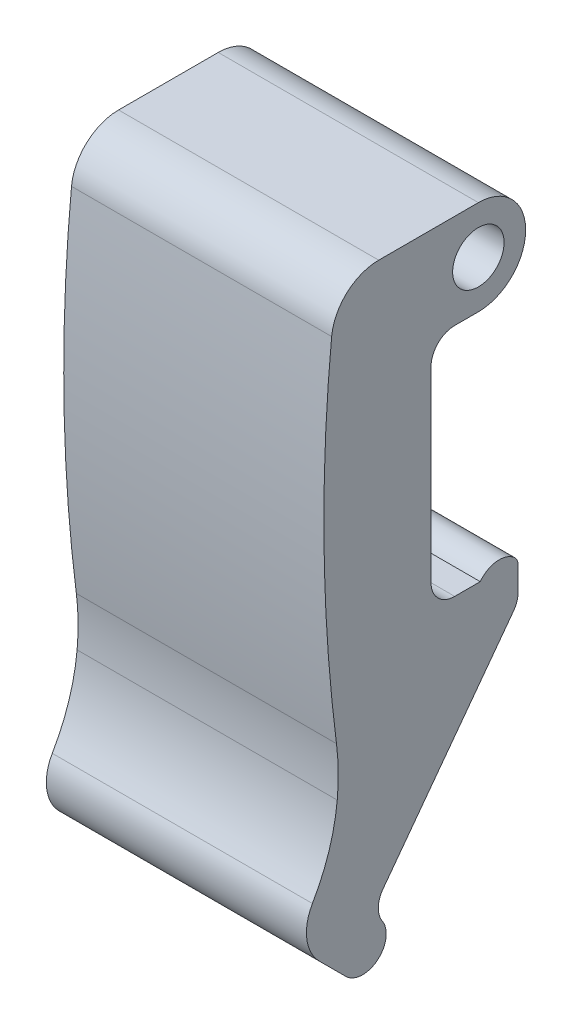
ISO-10303-21;
HEADER;
FILE_DESCRIPTION(('STEP AP214'),'2;1');
FILE_NAME('part.step','',(''),(''),'','','');
FILE_SCHEMA(('AUTOMOTIVE_DESIGN { 1 0 10303 214 1 1 1 1 }'));
ENDSEC;
DATA;
#1=APPLICATION_CONTEXT('core data for automotive mechanical design processes');
#2=APPLICATION_PROTOCOL_DEFINITION('international standard','automotive_design',2000,#1);
#3=PRODUCT_CONTEXT('',#1,'mechanical');
#4=PRODUCT('Part','Part','',(#3));
#5=PRODUCT_RELATED_PRODUCT_CATEGORY('part','',(#4));
#6=PRODUCT_DEFINITION_FORMATION('','',#4);
#7=PRODUCT_DEFINITION_CONTEXT('part definition',#1,'design');
#8=PRODUCT_DEFINITION('design','',#6,#7);
#9=PRODUCT_DEFINITION_SHAPE('','',#8);
#10=(LENGTH_UNIT() NAMED_UNIT(*) SI_UNIT(.MILLI.,.METRE.));
#11=(NAMED_UNIT(*) PLANE_ANGLE_UNIT() SI_UNIT($,.RADIAN.));
#12=(NAMED_UNIT(*) SI_UNIT($,.STERADIAN.) SOLID_ANGLE_UNIT());
#13=UNCERTAINTY_MEASURE_WITH_UNIT(LENGTH_MEASURE(1.E-05),#10,'distance_accuracy_value','');
#14=(GEOMETRIC_REPRESENTATION_CONTEXT(3) GLOBAL_UNCERTAINTY_ASSIGNED_CONTEXT((#13)) GLOBAL_UNIT_ASSIGNED_CONTEXT((#10,
#11,#12)) REPRESENTATION_CONTEXT('',''));
#15=CARTESIAN_POINT('',(0.,0.,0.));
#16=DIRECTION('',(0.,0.,1.));
#17=DIRECTION('',(1.,0.,0.));
#18=AXIS2_PLACEMENT_3D('',#15,#16,#17);
#19=CARTESIAN_POINT('',(8.73125,-19.8755,-1.397));
#20=DIRECTION('',(-1.,0.,0.));
#21=DIRECTION('',(0.,0.,1.));
#22=AXIS2_PLACEMENT_3D('',#19,#20,#21);
#23=CYLINDRICAL_SURFACE('',#22,1.5875);
#24=CARTESIAN_POINT('',(8.73125,-19.8755,-1.397));
#25=DIRECTION('',(1.,0.,0.));
#26=DIRECTION('',(0.,0.,1.));
#27=AXIS2_PLACEMENT_3D('',#24,#25,#26);
#28=CIRCLE('',#27,1.5875);
#29=CARTESIAN_POINT('',(8.73125,-18.6055,-2.3495));
#30=VERTEX_POINT('',#29);
#31=CARTESIAN_POINT('',(8.73125,-18.923,-0.127000000000002));
#32=VERTEX_POINT('',#31);
#33=EDGE_CURVE('E300',#30,#32,#28,.T.);
#34=ORIENTED_EDGE('',*,*,#33,.F.);
#35=DIRECTION('',(-1.,0.,0.));
#36=VECTOR('',#35,1.);
#37=CARTESIAN_POINT('',(8.73125,-18.6055,-2.3495));
#38=LINE('',#37,#36);
#39=CARTESIAN_POINT('',(-8.73125,-18.6055,-2.3495));
#40=VERTEX_POINT('',#39);
#41=EDGE_CURVE('E174',#30,#40,#38,.T.);
#42=ORIENTED_EDGE('',*,*,#41,.T.);
#43=CARTESIAN_POINT('',(-8.73125,-19.8755,-1.397));
#44=DIRECTION('',(1.,0.,0.));
#45=DIRECTION('',(0.,0.,1.));
#46=AXIS2_PLACEMENT_3D('',#43,#44,#45);
#47=CIRCLE('',#46,1.5875);
#48=CARTESIAN_POINT('',(-8.73125,-18.923,-0.127000000000002));
#49=VERTEX_POINT('',#48);
#50=EDGE_CURVE('E168',#40,#49,#47,.T.);
#51=ORIENTED_EDGE('',*,*,#50,.T.);
#52=DIRECTION('',(-1.,0.,0.));
#53=VECTOR('',#52,1.);
#54=CARTESIAN_POINT('',(8.73125,-18.923,-0.127000000000002));
#55=LINE('',#54,#53);
#56=EDGE_CURVE('E172',#32,#49,#55,.T.);
#57=ORIENTED_EDGE('',*,*,#56,.F.);
#58=EDGE_LOOP('',(#34,#42,#51,#57));
#59=FACE_BOUND('',#58,.T.);
#60=ADVANCED_FACE('F32',(#59),#23,.T.);
#61=CARTESIAN_POINT('',(8.73125,-18.923,3.175));
#62=DIRECTION('',(0.,-1.,0.));
#63=DIRECTION('',(0.,0.,-1.));
#64=AXIS2_PLACEMENT_3D('',#61,#62,#63);
#65=PLANE('',#64);
#66=DIRECTION('',(0.,0.,1.));
#67=VECTOR('',#66,1.);
#68=CARTESIAN_POINT('',(-8.73125,-18.923,3.175));
#69=LINE('',#68,#67);
#70=CARTESIAN_POINT('',(-8.73125,-18.923,1.5875));
#71=VERTEX_POINT('',#70);
#72=EDGE_CURVE('E175',#49,#71,#69,.T.);
#73=ORIENTED_EDGE('',*,*,#72,.T.);
#74=DIRECTION('',(-1.,0.,0.));
#75=VECTOR('',#74,1.);
#76=CARTESIAN_POINT('',(8.73125,-18.923,1.5875));
#77=LINE('',#76,#75);
#78=CARTESIAN_POINT('',(8.73125,-18.923,1.5875));
#79=VERTEX_POINT('',#78);
#80=EDGE_CURVE('E225',#71,#79,#77,.F.);
#81=ORIENTED_EDGE('',*,*,#80,.T.);
#82=DIRECTION('',(0.,0.,1.));
#83=VECTOR('',#82,1.);
#84=CARTESIAN_POINT('',(8.73125,-18.923,3.175));
#85=LINE('',#84,#83);
#86=EDGE_CURVE('E189',#32,#79,#85,.T.);
#87=ORIENTED_EDGE('',*,*,#86,.F.);
#88=ORIENTED_EDGE('',*,*,#56,.T.);
#89=EDGE_LOOP('',(#73,#81,#87,#88));
#90=FACE_BOUND('',#89,.T.);
#91=ADVANCED_FACE('F187',(#90),#65,.F.);
#92=CARTESIAN_POINT('',(8.73125,-3.175,3.175));
#93=DIRECTION('',(0.,0.,1.));
#94=DIRECTION('',(0.,-1.,0.));
#95=AXIS2_PLACEMENT_3D('',#92,#93,#94);
#96=PLANE('',#95);
#97=DIRECTION('',(0.,1.,0.));
#98=VECTOR('',#97,1.);
#99=CARTESIAN_POINT('',(8.73125,-3.175,3.175));
#100=LINE('',#99,#98);
#101=CARTESIAN_POINT('',(8.73125,-17.3355,3.175));
#102=VERTEX_POINT('',#101);
#103=CARTESIAN_POINT('',(8.73125,-4.7625,3.175));
#104=VERTEX_POINT('',#103);
#105=EDGE_CURVE('E303',#102,#104,#100,.T.);
#106=ORIENTED_EDGE('',*,*,#105,.F.);
#107=DIRECTION('',(-1.,0.,0.));
#108=VECTOR('',#107,1.);
#109=CARTESIAN_POINT('',(-8.73125,-17.3355,3.175));
#110=LINE('',#109,#108);
#111=CARTESIAN_POINT('',(-8.73125,-17.3355,3.175));
#112=VERTEX_POINT('',#111);
#113=EDGE_CURVE('E222',#102,#112,#110,.T.);
#114=ORIENTED_EDGE('',*,*,#113,.T.);
#115=DIRECTION('',(0.,1.,0.));
#116=VECTOR('',#115,1.);
#117=CARTESIAN_POINT('',(-8.73125,-3.175,3.175));
#118=LINE('',#117,#116);
#119=CARTESIAN_POINT('',(-8.73125,-4.7625,3.175));
#120=VERTEX_POINT('',#119);
#121=EDGE_CURVE('E184',#112,#120,#118,.T.);
#122=ORIENTED_EDGE('',*,*,#121,.T.);
#123=DIRECTION('',(-1.,0.,0.));
#124=VECTOR('',#123,1.);
#125=CARTESIAN_POINT('',(8.73125,-4.7625,3.175));
#126=LINE('',#125,#124);
#127=EDGE_CURVE('E220',#120,#104,#126,.F.);
#128=ORIENTED_EDGE('',*,*,#127,.T.);
#129=EDGE_LOOP('',(#106,#114,#122,#128));
#130=FACE_BOUND('',#129,.T.);
#131=ADVANCED_FACE('F377',(#130),#96,.F.);
#132=CARTESIAN_POINT('',(8.73125,-3.175,0.));
#133=DIRECTION('',(0.,1.,0.));
#134=DIRECTION('',(0.,0.,1.));
#135=AXIS2_PLACEMENT_3D('',#132,#133,#134);
#136=PLANE('',#135);
#137=DIRECTION('',(0.,0.,-1.));
#138=VECTOR('',#137,1.);
#139=CARTESIAN_POINT('',(8.73125,-3.175,0.));
#140=LINE('',#139,#138);
#141=CARTESIAN_POINT('',(8.73125,-3.175,1.5875));
#142=VERTEX_POINT('',#141);
#143=CARTESIAN_POINT('',(8.73125,-3.175,0.));
#144=VERTEX_POINT('',#143);
#145=EDGE_CURVE('E306',#142,#144,#140,.T.);
#146=ORIENTED_EDGE('',*,*,#145,.F.);
#147=DIRECTION('',(-1.,0.,0.));
#148=VECTOR('',#147,1.);
#149=CARTESIAN_POINT('',(-8.73125,-3.175,1.5875));
#150=LINE('',#149,#148);
#151=CARTESIAN_POINT('',(-8.73125,-3.175,1.5875));
#152=VERTEX_POINT('',#151);
#153=EDGE_CURVE('E227',#142,#152,#150,.T.);
#154=ORIENTED_EDGE('',*,*,#153,.T.);
#155=DIRECTION('',(0.,0.,-1.));
#156=VECTOR('',#155,1.);
#157=CARTESIAN_POINT('',(-8.73125,-3.175,0.));
#158=LINE('',#157,#156);
#159=CARTESIAN_POINT('',(-8.73125,-3.175,0.));
#160=VERTEX_POINT('',#159);
#161=EDGE_CURVE('E342',#152,#160,#158,.T.);
#162=ORIENTED_EDGE('',*,*,#161,.T.);
#163=DIRECTION('',(-1.,0.,0.));
#164=VECTOR('',#163,1.);
#165=CARTESIAN_POINT('',(8.73125,-3.175,0.));
#166=LINE('',#165,#164);
#167=EDGE_CURVE('E191',#144,#160,#166,.T.);
#168=ORIENTED_EDGE('',*,*,#167,.F.);
#169=EDGE_LOOP('',(#146,#154,#162,#168));
#170=FACE_BOUND('',#169,.T.);
#171=ADVANCED_FACE('F381',(#170),#136,.F.);
#172=CARTESIAN_POINT('',(8.73125,0.,0.));
#173=DIRECTION('',(-1.,0.,0.));
#174=DIRECTION('',(0.,0.,1.));
#175=AXIS2_PLACEMENT_3D('',#172,#173,#174);
#176=CYLINDRICAL_SURFACE('',#175,3.175);
#177=CARTESIAN_POINT('',(-8.73125,0.,0.));
#178=DIRECTION('',(1.,0.,0.));
#179=DIRECTION('',(0.,0.,-1.));
#180=AXIS2_PLACEMENT_3D('',#177,#178,#179);
#181=CIRCLE('',#180,3.175);
#182=CARTESIAN_POINT('',(-8.73125,3.175,0.));
#183=VERTEX_POINT('',#182);
#184=EDGE_CURVE('E341',#160,#183,#181,.T.);
#185=ORIENTED_EDGE('',*,*,#184,.T.);
#186=DIRECTION('',(-1.,0.,0.));
#187=VECTOR('',#186,1.);
#188=CARTESIAN_POINT('',(8.73125,3.175,0.));
#189=LINE('',#188,#187);
#190=CARTESIAN_POINT('',(8.73125,3.175,0.));
#191=VERTEX_POINT('',#190);
#192=EDGE_CURVE('E197',#191,#183,#189,.T.);
#193=ORIENTED_EDGE('',*,*,#192,.F.);
#194=CARTESIAN_POINT('',(8.73125,0.,0.));
#195=DIRECTION('',(1.,0.,0.));
#196=DIRECTION('',(0.,0.,-1.));
#197=AXIS2_PLACEMENT_3D('',#194,#195,#196);
#198=CIRCLE('',#197,3.175);
#199=EDGE_CURVE('E308',#144,#191,#198,.T.);
#200=ORIENTED_EDGE('',*,*,#199,.F.);
#201=ORIENTED_EDGE('',*,*,#167,.T.);
#202=EDGE_LOOP('',(#185,#193,#200,#201));
#203=FACE_BOUND('',#202,.T.);
#204=ADVANCED_FACE('F387',(#203),#176,.T.);
#205=CARTESIAN_POINT('',(8.73125,3.175,0.));
#206=DIRECTION('',(0.,-1.,0.));
#207=DIRECTION('',(0.,0.,-1.));
#208=AXIS2_PLACEMENT_3D('',#205,#206,#207);
#209=PLANE('',#208);
#210=DIRECTION('',(0.,0.,1.));
#211=VECTOR('',#210,1.);
#212=CARTESIAN_POINT('',(-8.73125,3.175,0.));
#213=LINE('',#212,#211);
#214=CARTESIAN_POINT('',(-8.73125,3.175,6.69032357202773));
#215=VERTEX_POINT('',#214);
#216=EDGE_CURVE('E287',#183,#215,#213,.T.);
#217=ORIENTED_EDGE('',*,*,#216,.T.);
#218=DIRECTION('',(-1.,0.,0.));
#219=VECTOR('',#218,1.);
#220=CARTESIAN_POINT('',(8.73125,3.175,6.69032357202773));
#221=LINE('',#220,#219);
#222=CARTESIAN_POINT('',(8.73125,3.175,6.69032357202773));
#223=VERTEX_POINT('',#222);
#224=EDGE_CURVE('E202',#215,#223,#221,.F.);
#225=ORIENTED_EDGE('',*,*,#224,.T.);
#226=DIRECTION('',(0.,0.,1.));
#227=VECTOR('',#226,1.);
#228=CARTESIAN_POINT('',(8.73125,3.175,0.));
#229=LINE('',#228,#227);
#230=EDGE_CURVE('E310',#191,#223,#229,.T.);
#231=ORIENTED_EDGE('',*,*,#230,.F.);
#232=ORIENTED_EDGE('',*,*,#192,.T.);
#233=EDGE_LOOP('',(#217,#225,#231,#232));
#234=FACE_BOUND('',#233,.T.);
#235=ADVANCED_FACE('F335',(#234),#209,.F.);
#236=CARTESIAN_POINT('',(8.73125,-10.1699174716173,-95.2740901224179));
#237=DIRECTION('',(-1.,0.,0.));
#238=DIRECTION('',(0.,0.,1.));
#239=AXIS2_PLACEMENT_3D('',#236,#237,#238);
#240=CYLINDRICAL_SURFACE('',#239,105.645331713289);
#241=CARTESIAN_POINT('',(8.73125,-10.1699174716173,-95.2740901224179));
#242=DIRECTION('',(1.,0.,0.));
#243=DIRECTION('',(0.,0.,-1.));
#244=AXIS2_PLACEMENT_3D('',#241,#242,#243);
#245=CIRCLE('',#244,105.645331713289);
#246=CARTESIAN_POINT('',(8.73125,0.315110602576465,9.84964791564044));
#247=VERTEX_POINT('',#246);
#248=CARTESIAN_POINT('',(8.73125,-23.5148349432345,9.52500000000001));
#249=VERTEX_POINT('',#248);
#250=EDGE_CURVE('E313',#247,#249,#245,.T.);
#251=ORIENTED_EDGE('',*,*,#250,.F.);
#252=DIRECTION('',(-1.,0.,0.));
#253=VECTOR('',#252,1.);
#254=CARTESIAN_POINT('',(8.73125,0.315110602576465,9.84964791564044));
#255=LINE('',#254,#253);
#256=CARTESIAN_POINT('',(-8.73125,0.315110602576465,9.84964791564044));
#257=VERTEX_POINT('',#256);
#258=EDGE_CURVE('E190',#247,#257,#255,.T.);
#259=ORIENTED_EDGE('',*,*,#258,.T.);
#260=CARTESIAN_POINT('',(-8.73125,-10.1699174716173,-95.2740901224179));
#261=DIRECTION('',(1.,0.,0.));
#262=DIRECTION('',(0.,0.,-1.));
#263=AXIS2_PLACEMENT_3D('',#260,#261,#262);
#264=CIRCLE('',#263,105.645331713289);
#265=CARTESIAN_POINT('',(-8.73125,-23.5148349432345,9.52500000000001));
#266=VERTEX_POINT('',#265);
#267=EDGE_CURVE('E283',#257,#266,#264,.T.);
#268=ORIENTED_EDGE('',*,*,#267,.T.);
#269=DIRECTION('',(-1.,0.,0.));
#270=VECTOR('',#269,1.);
#271=CARTESIAN_POINT('',(8.73125,-23.5148349432345,9.52500000000001));
#272=LINE('',#271,#270);
#273=EDGE_CURVE('E282',#249,#266,#272,.T.);
#274=ORIENTED_EDGE('',*,*,#273,.F.);
#275=EDGE_LOOP('',(#251,#259,#268,#274));
#276=FACE_BOUND('',#275,.T.);
#277=ADVANCED_FACE('F393',(#276),#240,.T.);
#278=CARTESIAN_POINT('',(8.73125,-25.4,24.3294064790796));
#279=DIRECTION('',(-1.,0.,0.));
#280=DIRECTION('',(0.,0.,1.));
#281=AXIS2_PLACEMENT_3D('',#278,#279,#280);
#282=CYLINDRICAL_SURFACE('',#281,14.9239504987474);
#283=CARTESIAN_POINT('',(-8.73125,-25.4,24.3294064790796));
#284=DIRECTION('',(-1.,0.,0.));
#285=DIRECTION('',(0.,0.,1.));
#286=AXIS2_PLACEMENT_3D('',#283,#284,#285);
#287=CIRCLE('',#286,14.9239504987474);
#288=CARTESIAN_POINT('',(-8.73125,-26.8210055343094,9.47326156323667));
#289=VERTEX_POINT('',#288);
#290=EDGE_CURVE('E275',#266,#289,#287,.T.);
#291=ORIENTED_EDGE('',*,*,#290,.T.);
#292=DIRECTION('',(-1.,0.,0.));
#293=VECTOR('',#292,1.);
#294=CARTESIAN_POINT('',(8.73125,-26.8210055343094,9.47326156323667));
#295=LINE('',#294,#293);
#296=CARTESIAN_POINT('',(8.73125,-26.8210055343094,9.47326156323667));
#297=VERTEX_POINT('',#296);
#298=EDGE_CURVE('E244',#289,#297,#295,.F.);
#299=ORIENTED_EDGE('',*,*,#298,.T.);
#300=CARTESIAN_POINT('',(8.73125,-25.4,24.3294064790796));
#301=DIRECTION('',(-1.,0.,0.));
#302=DIRECTION('',(0.,0.,1.));
#303=AXIS2_PLACEMENT_3D('',#300,#301,#302);
#304=CIRCLE('',#303,14.9239504987474);
#305=EDGE_CURVE('E259',#249,#297,#304,.T.);
#306=ORIENTED_EDGE('',*,*,#305,.F.);
#307=ORIENTED_EDGE('',*,*,#273,.T.);
#308=EDGE_LOOP('',(#291,#299,#306,#307));
#309=FACE_BOUND('',#308,.T.);
#310=ADVANCED_FACE('F280',(#309),#282,.F.);
#311=CARTESIAN_POINT('',(8.73125,-33.4915368486735,8.58155713095243));
#312=DIRECTION('',(-1.,0.,0.));
#313=DIRECTION('',(0.,0.,1.));
#314=AXIS2_PLACEMENT_3D('',#311,#312,#313);
#315=CYLINDRICAL_SURFACE('',#314,2.96078469777265);
#316=CARTESIAN_POINT('',(8.73125,-33.4915368486735,8.58155713095243));
#317=DIRECTION('',(1.,0.,0.));
#318=DIRECTION('',(0.,0.,1.));
#319=AXIS2_PLACEMENT_3D('',#316,#317,#318);
#320=CIRCLE('',#319,2.96078469777265);
#321=CARTESIAN_POINT('',(8.73125,-32.0018073719112,11.1402583860094));
#322=VERTEX_POINT('',#321);
#323=CARTESIAN_POINT('',(8.73125,-35.5851277861019,10.6751480683808));
#324=VERTEX_POINT('',#323);
#325=EDGE_CURVE('E256',#322,#324,#320,.T.);
#326=ORIENTED_EDGE('',*,*,#325,.F.);
#327=DIRECTION('',(-1.,0.,0.));
#328=VECTOR('',#327,1.);
#329=CARTESIAN_POINT('',(8.73125,-32.0018073719112,11.1402583860094));
#330=LINE('',#329,#328);
#331=CARTESIAN_POINT('',(-8.73125,-32.0018073719112,11.1402583860094));
#332=VERTEX_POINT('',#331);
#333=EDGE_CURVE('E241',#322,#332,#330,.T.);
#334=ORIENTED_EDGE('',*,*,#333,.T.);
#335=CARTESIAN_POINT('',(-8.73125,-33.4915368486735,8.58155713095243));
#336=DIRECTION('',(1.,0.,0.));
#337=DIRECTION('',(0.,0.,1.));
#338=AXIS2_PLACEMENT_3D('',#335,#336,#337);
#339=CIRCLE('',#338,2.96078469777265);
#340=CARTESIAN_POINT('',(-8.73125,-35.5851277861019,10.6751480683808));
#341=VERTEX_POINT('',#340);
#342=EDGE_CURVE('E277',#332,#341,#339,.T.);
#343=ORIENTED_EDGE('',*,*,#342,.T.);
#344=DIRECTION('',(-1.,0.,0.));
#345=VECTOR('',#344,1.);
#346=CARTESIAN_POINT('',(8.73125,-35.5851277861019,10.6751480683808));
#347=LINE('',#346,#345);
#348=EDGE_CURVE('E267',#324,#341,#347,.T.);
#349=ORIENTED_EDGE('',*,*,#348,.F.);
#350=EDGE_LOOP('',(#326,#334,#343,#349));
#351=FACE_BOUND('',#350,.T.);
#352=ADVANCED_FACE('F264',(#351),#315,.T.);
#353=CARTESIAN_POINT('',(8.73125,-36.8270118242155,9.43326403026727));
#354=DIRECTION('',(0.,0.707106781186568,-0.707106781186527));
#355=DIRECTION('',(0.,0.707106781186527,0.707106781186568));
#356=AXIS2_PLACEMENT_3D('',#353,#354,#355);
#357=PLANE('',#356);
#358=DIRECTION('',(0.,-0.707106781186527,-0.707106781186568));
#359=VECTOR('',#358,1.);
#360=CARTESIAN_POINT('',(-8.73125,-36.8270118242155,9.43326403026727));
#361=LINE('',#360,#359);
#362=CARTESIAN_POINT('',(-8.73125,-37.3658271914796,8.89444866300314));
#363=VERTEX_POINT('',#362);
#364=EDGE_CURVE('E285',#341,#363,#361,.T.);
#365=ORIENTED_EDGE('',*,*,#364,.T.);
#366=DIRECTION('',(-1.,0.,0.));
#367=VECTOR('',#366,1.);
#368=CARTESIAN_POINT('',(8.73125,-37.3658271914796,8.89444866300314));
#369=LINE('',#368,#367);
#370=CARTESIAN_POINT('',(8.73125,-37.3658271914796,8.89444866300314));
#371=VERTEX_POINT('',#370);
#372=EDGE_CURVE('E325',#371,#363,#369,.T.);
#373=ORIENTED_EDGE('',*,*,#372,.F.);
#374=DIRECTION('',(0.,-0.707106781186556,-0.707106781186539));
#375=VECTOR('',#374,1.);
#376=CARTESIAN_POINT('',(8.73125,-36.8270118242155,9.43326403026727));
#377=LINE('',#376,#375);
#378=EDGE_CURVE('E269',#324,#371,#377,.T.);
#379=ORIENTED_EDGE('',*,*,#378,.F.);
#380=ORIENTED_EDGE('',*,*,#348,.T.);
#381=EDGE_LOOP('',(#365,#373,#379,#380));
#382=FACE_BOUND('',#381,.T.);
#383=ADVANCED_FACE('F401',(#382),#357,.F.);
#384=CARTESIAN_POINT('',(8.73125,-36.2432951763459,7.77191664786949));
#385=DIRECTION('',(-1.,0.,0.));
#386=DIRECTION('',(0.,0.,1.));
#387=AXIS2_PLACEMENT_3D('',#384,#385,#386);
#388=CYLINDRICAL_SURFACE('',#387,1.5875);
#389=CARTESIAN_POINT('',(-8.73125,-36.2432951763459,7.77191664786949));
#390=DIRECTION('',(1.,0.,0.));
#391=DIRECTION('',(0.,0.,1.));
#392=AXIS2_PLACEMENT_3D('',#389,#390,#391);
#393=CIRCLE('',#392,1.5875);
#394=CARTESIAN_POINT('',(-8.73125,-35.3609089618565,6.45223834673738));
#395=VERTEX_POINT('',#394);
#396=EDGE_CURVE('E292',#363,#395,#393,.T.);
#397=ORIENTED_EDGE('',*,*,#396,.T.);
#398=DIRECTION('',(-1.,0.,0.));
#399=VECTOR('',#398,1.);
#400=CARTESIAN_POINT('',(8.73125,-35.3609089618565,6.45223834673738));
#401=LINE('',#400,#399);
#402=CARTESIAN_POINT('',(8.73125,-35.3609089618565,6.45223834673738));
#403=VERTEX_POINT('',#402);
#404=EDGE_CURVE('E211',#395,#403,#401,.F.);
#405=ORIENTED_EDGE('',*,*,#404,.T.);
#406=CARTESIAN_POINT('',(8.73125,-36.2432951763459,7.77191664786949));
#407=DIRECTION('',(1.,0.,0.));
#408=DIRECTION('',(0.,0.,1.));
#409=AXIS2_PLACEMENT_3D('',#406,#407,#408);
#410=CIRCLE('',#409,1.5875);
#411=EDGE_CURVE('E317',#371,#403,#410,.T.);
#412=ORIENTED_EDGE('',*,*,#411,.F.);
#413=ORIENTED_EDGE('',*,*,#372,.T.);
#414=EDGE_LOOP('',(#397,#405,#412,#413));
#415=FACE_BOUND('',#414,.T.);
#416=ADVANCED_FACE('F404',(#415),#388,.T.);
#417=CARTESIAN_POINT('',(8.73125,-21.336,-2.667));
#418=DIRECTION('',(0.,0.596923076923077,0.802298473285776));
#419=DIRECTION('',(0.,-0.802298473285776,0.596923076923077));
#420=AXIS2_PLACEMENT_3D('',#417,#418,#419);
#421=PLANE('',#420);
#422=DIRECTION('',(0.,0.802298473285776,-0.596923076923077));
#423=VECTOR('',#422,1.);
#424=CARTESIAN_POINT('',(8.73125,-21.336,-2.667));
#425=LINE('',#424,#423);
#426=CARTESIAN_POINT('',(8.73125,-33.5309073627516,6.40620887194644));
#427=VERTEX_POINT('',#426);
#428=CARTESIAN_POINT('',(8.73125,-21.7578337792591,-2.35314882634117));
#429=VERTEX_POINT('',#428);
#430=EDGE_CURVE('E320',#427,#429,#425,.T.);
#431=ORIENTED_EDGE('',*,*,#430,.F.);
#432=DIRECTION('',(1.,0.,0.));
#433=VECTOR('',#432,1.);
#434=CARTESIAN_POINT('',(-8.73125,-33.5309073627516,6.40620887194644));
#435=LINE('',#434,#433);
#436=CARTESIAN_POINT('',(-8.73125,-33.5309073627516,6.40620887194644));
#437=VERTEX_POINT('',#436);
#438=EDGE_CURVE('E208',#427,#437,#435,.F.);
#439=ORIENTED_EDGE('',*,*,#438,.T.);
#440=DIRECTION('',(0.,0.802298473285776,-0.596923076923077));
#441=VECTOR('',#440,1.);
#442=CARTESIAN_POINT('',(-8.73125,-21.336,-2.667));
#443=LINE('',#442,#441);
#444=CARTESIAN_POINT('',(-8.73125,-21.7578337792591,-2.35314882634117));
#445=VERTEX_POINT('',#444);
#446=EDGE_CURVE('E295',#437,#445,#443,.T.);
#447=ORIENTED_EDGE('',*,*,#446,.T.);
#448=DIRECTION('',(-1.,0.,0.));
#449=VECTOR('',#448,1.);
#450=CARTESIAN_POINT('',(8.73125,-21.7578337792591,-2.35314882634117));
#451=LINE('',#450,#449);
#452=EDGE_CURVE('E206',#445,#429,#451,.F.);
#453=ORIENTED_EDGE('',*,*,#452,.T.);
#454=EDGE_LOOP('',(#431,#439,#447,#453));
#455=FACE_BOUND('',#454,.T.);
#456=ADVANCED_FACE('F371',(#455),#421,.F.);
#457=CARTESIAN_POINT('',(8.73125,-18.923,-2.667));
#458=DIRECTION('',(0.,0.,1.));
#459=DIRECTION('',(0.,-1.,0.));
#460=AXIS2_PLACEMENT_3D('',#457,#458,#459);
#461=PLANE('',#460);
#462=DIRECTION('',(0.,1.,0.));
#463=VECTOR('',#462,1.);
#464=CARTESIAN_POINT('',(-8.73125,-18.923,-2.667));
#465=LINE('',#464,#463);
#466=CARTESIAN_POINT('',(-8.73125,-20.8102183946437,-2.667));
#467=VERTEX_POINT('',#466);
#468=CARTESIAN_POINT('',(-8.73125,-19.2405,-2.667));
#469=VERTEX_POINT('',#468);
#470=EDGE_CURVE('E298',#467,#469,#465,.T.);
#471=ORIENTED_EDGE('',*,*,#470,.T.);
#472=DIRECTION('',(-1.,0.,0.));
#473=VECTOR('',#472,1.);
#474=CARTESIAN_POINT('',(8.73125,-19.2405,-2.667));
#475=LINE('',#474,#473);
#476=CARTESIAN_POINT('',(8.73125,-19.2405,-2.667));
#477=VERTEX_POINT('',#476);
#478=EDGE_CURVE('E39',#469,#477,#475,.F.);
#479=ORIENTED_EDGE('',*,*,#478,.T.);
#480=DIRECTION('',(0.,1.,0.));
#481=VECTOR('',#480,1.);
#482=CARTESIAN_POINT('',(8.73125,-18.923,-2.667));
#483=LINE('',#482,#481);
#484=CARTESIAN_POINT('',(8.73125,-20.8102183946437,-2.667));
#485=VERTEX_POINT('',#484);
#486=EDGE_CURVE('E323',#485,#477,#483,.T.);
#487=ORIENTED_EDGE('',*,*,#486,.F.);
#488=DIRECTION('',(-1.,0.,0.));
#489=VECTOR('',#488,1.);
#490=CARTESIAN_POINT('',(8.73125,-20.8102183946437,-2.667));
#491=LINE('',#490,#489);
#492=EDGE_CURVE('E213',#485,#467,#491,.T.);
#493=ORIENTED_EDGE('',*,*,#492,.T.);
#494=EDGE_LOOP('',(#471,#479,#487,#493));
#495=FACE_BOUND('',#494,.T.);
#496=ADVANCED_FACE('F363',(#495),#461,.F.);
#497=CARTESIAN_POINT('',(8.73125,-19.8755,-1.397));
#498=DIRECTION('',(-1.,0.,0.));
#499=DIRECTION('',(0.,0.,1.));
#500=AXIS2_PLACEMENT_3D('',#497,#498,#499);
#501=PLANE('',#500);
#502=CARTESIAN_POINT('',(8.73125,0.,0.));
#503=DIRECTION('',(1.,0.,0.));
#504=DIRECTION('',(0.,0.,-1.));
#505=AXIS2_PLACEMENT_3D('',#502,#503,#504);
#506=CIRCLE('',#505,1.72719999999999);
#507=CARTESIAN_POINT('',(8.73125,0.,-1.72719999999999));
#508=VERTEX_POINT('',#507);
#509=EDGE_CURVE('E176',#508,#508,#506,.T.);
#510=ORIENTED_EDGE('',*,*,#509,.F.);
#511=EDGE_LOOP('',(#510));
#512=FACE_BOUND('',#511,.T.);
#513=ORIENTED_EDGE('',*,*,#486,.T.);
#514=CARTESIAN_POINT('',(8.73125,-19.2405,-1.87325));
#515=DIRECTION('',(-1.,0.,0.));
#516=DIRECTION('',(0.,0.,1.));
#517=AXIS2_PLACEMENT_3D('',#514,#515,#516);
#518=CIRCLE('',#517,0.79375);
#519=EDGE_CURVE('E11',#477,#30,#518,.F.);
#520=ORIENTED_EDGE('',*,*,#519,.T.);
#521=ORIENTED_EDGE('',*,*,#33,.T.);
#522=ORIENTED_EDGE('',*,*,#86,.T.);
#523=CARTESIAN_POINT('',(8.73125,-17.3355,1.5875));
#524=DIRECTION('',(-1.,0.,0.));
#525=DIRECTION('',(0.,0.,1.));
#526=AXIS2_PLACEMENT_3D('',#523,#524,#525);
#527=CIRCLE('',#526,1.5875);
#528=EDGE_CURVE('E235',#79,#102,#527,.T.);
#529=ORIENTED_EDGE('',*,*,#528,.T.);
#530=ORIENTED_EDGE('',*,*,#105,.T.);
#531=CARTESIAN_POINT('',(8.73125,-4.7625,1.5875));
#532=DIRECTION('',(-1.,0.,0.));
#533=DIRECTION('',(0.,0.,1.));
#534=AXIS2_PLACEMENT_3D('',#531,#532,#533);
#535=CIRCLE('',#534,1.5875);
#536=EDGE_CURVE('E239',#104,#142,#535,.T.);
#537=ORIENTED_EDGE('',*,*,#536,.T.);
#538=ORIENTED_EDGE('',*,*,#145,.T.);
#539=ORIENTED_EDGE('',*,*,#199,.T.);
#540=ORIENTED_EDGE('',*,*,#230,.T.);
#541=CARTESIAN_POINT('',(8.73125,0.,6.69032357202773));
#542=DIRECTION('',(-1.,0.,0.));
#543=DIRECTION('',(0.,0.,1.));
#544=AXIS2_PLACEMENT_3D('',#541,#542,#543);
#545=CIRCLE('',#544,3.175);
#546=EDGE_CURVE('E204',#223,#247,#545,.F.);
#547=ORIENTED_EDGE('',*,*,#546,.T.);
#548=ORIENTED_EDGE('',*,*,#250,.T.);
#549=ORIENTED_EDGE('',*,*,#305,.T.);
#550=CARTESIAN_POINT('',(8.73125,-25.6117566636941,22.1155602928553));
#551=DIRECTION('',(-1.,0.,0.));
#552=DIRECTION('',(0.,0.,1.));
#553=AXIS2_PLACEMENT_3D('',#550,#551,#552);
#554=CIRCLE('',#553,12.7);
#555=EDGE_CURVE('E248',#297,#322,#554,.T.);
#556=ORIENTED_EDGE('',*,*,#555,.T.);
#557=ORIENTED_EDGE('',*,*,#325,.T.);
#558=ORIENTED_EDGE('',*,*,#378,.T.);
#559=ORIENTED_EDGE('',*,*,#411,.T.);
#560=CARTESIAN_POINT('',(8.73125,-34.478522747367,5.13256004560527));
#561=DIRECTION('',(-1.,0.,0.));
#562=DIRECTION('',(0.,0.,1.));
#563=AXIS2_PLACEMENT_3D('',#560,#561,#562);
#564=CIRCLE('',#563,1.5875);
#565=EDGE_CURVE('E232',#403,#427,#564,.T.);
#566=ORIENTED_EDGE('',*,*,#565,.T.);
#567=ORIENTED_EDGE('',*,*,#430,.T.);
#568=CARTESIAN_POINT('',(8.73125,-20.8102183946437,-1.0795));
#569=DIRECTION('',(-1.,0.,0.));
#570=DIRECTION('',(0.,0.,1.));
#571=AXIS2_PLACEMENT_3D('',#568,#569,#570);
#572=CIRCLE('',#571,1.5875);
#573=EDGE_CURVE('E218',#429,#485,#572,.F.);
#574=ORIENTED_EDGE('',*,*,#573,.T.);
#575=EDGE_LOOP('',(#513,#520,#521,#522,#529,#530,#537,#538,#539,#540,#547,#548,#549,#556,#557,
#558,#559,#566,#567,#574));
#576=FACE_BOUND('',#575,.T.);
#577=ADVANCED_FACE('F255',(#512,#576),#501,.F.);
#578=CARTESIAN_POINT('',(-8.73125,-19.8755,-1.397));
#579=DIRECTION('',(-1.,0.,0.));
#580=DIRECTION('',(0.,0.,1.));
#581=AXIS2_PLACEMENT_3D('',#578,#579,#580);
#582=PLANE('',#581);
#583=CARTESIAN_POINT('',(-8.73125,0.,0.));
#584=DIRECTION('',(1.,0.,0.));
#585=DIRECTION('',(0.,0.,-1.));
#586=AXIS2_PLACEMENT_3D('',#583,#584,#585);
#587=CIRCLE('',#586,1.7272);
#588=CARTESIAN_POINT('',(-8.73125,0.,-1.7272));
#589=VERTEX_POINT('',#588);
#590=EDGE_CURVE('E350',#589,#589,#587,.T.);
#591=ORIENTED_EDGE('',*,*,#590,.T.);
#592=EDGE_LOOP('',(#591));
#593=FACE_BOUND('',#592,.T.);
#594=ORIENTED_EDGE('',*,*,#50,.F.);
#595=CARTESIAN_POINT('',(-8.73125,-19.2405,-1.87325));
#596=DIRECTION('',(-1.,0.,0.));
#597=DIRECTION('',(0.,0.,1.));
#598=AXIS2_PLACEMENT_3D('',#595,#596,#597);
#599=CIRCLE('',#598,0.79375);
#600=EDGE_CURVE('E53',#40,#469,#599,.T.);
#601=ORIENTED_EDGE('',*,*,#600,.T.);
#602=ORIENTED_EDGE('',*,*,#470,.F.);
#603=CARTESIAN_POINT('',(-8.73125,-20.8102183946437,-1.0795));
#604=DIRECTION('',(-1.,0.,0.));
#605=DIRECTION('',(0.,0.,1.));
#606=AXIS2_PLACEMENT_3D('',#603,#604,#605);
#607=CIRCLE('',#606,1.5875);
#608=EDGE_CURVE('E216',#467,#445,#607,.T.);
#609=ORIENTED_EDGE('',*,*,#608,.T.);
#610=ORIENTED_EDGE('',*,*,#446,.F.);
#611=CARTESIAN_POINT('',(-8.73125,-34.478522747367,5.13256004560527));
#612=DIRECTION('',(-1.,0.,0.));
#613=DIRECTION('',(0.,0.,1.));
#614=AXIS2_PLACEMENT_3D('',#611,#612,#613);
#615=CIRCLE('',#614,1.5875);
#616=EDGE_CURVE('E230',#437,#395,#615,.F.);
#617=ORIENTED_EDGE('',*,*,#616,.T.);
#618=ORIENTED_EDGE('',*,*,#396,.F.);
#619=ORIENTED_EDGE('',*,*,#364,.F.);
#620=ORIENTED_EDGE('',*,*,#342,.F.);
#621=CARTESIAN_POINT('',(-8.73125,-25.6117566636941,22.1155602928553));
#622=DIRECTION('',(-1.,0.,0.));
#623=DIRECTION('',(0.,0.,1.));
#624=AXIS2_PLACEMENT_3D('',#621,#622,#623);
#625=CIRCLE('',#624,12.7);
#626=EDGE_CURVE('E246',#332,#289,#625,.F.);
#627=ORIENTED_EDGE('',*,*,#626,.T.);
#628=ORIENTED_EDGE('',*,*,#290,.F.);
#629=ORIENTED_EDGE('',*,*,#267,.F.);
#630=CARTESIAN_POINT('',(-8.73125,0.,6.69032357202773));
#631=DIRECTION('',(-1.,0.,0.));
#632=DIRECTION('',(0.,0.,1.));
#633=AXIS2_PLACEMENT_3D('',#630,#631,#632);
#634=CIRCLE('',#633,3.175);
#635=EDGE_CURVE('E194',#257,#215,#634,.T.);
#636=ORIENTED_EDGE('',*,*,#635,.T.);
#637=ORIENTED_EDGE('',*,*,#216,.F.);
#638=ORIENTED_EDGE('',*,*,#184,.F.);
#639=ORIENTED_EDGE('',*,*,#161,.F.);
#640=CARTESIAN_POINT('',(-8.73125,-4.7625,1.5875));
#641=DIRECTION('',(-1.,0.,0.));
#642=DIRECTION('',(0.,0.,1.));
#643=AXIS2_PLACEMENT_3D('',#640,#641,#642);
#644=CIRCLE('',#643,1.5875);
#645=EDGE_CURVE('E237',#152,#120,#644,.F.);
#646=ORIENTED_EDGE('',*,*,#645,.T.);
#647=ORIENTED_EDGE('',*,*,#121,.F.);
#648=CARTESIAN_POINT('',(-8.73125,-17.3355,1.5875));
#649=DIRECTION('',(-1.,0.,0.));
#650=DIRECTION('',(0.,0.,1.));
#651=AXIS2_PLACEMENT_3D('',#648,#649,#650);
#652=CIRCLE('',#651,1.5875);
#653=EDGE_CURVE('E181',#112,#71,#652,.F.);
#654=ORIENTED_EDGE('',*,*,#653,.T.);
#655=ORIENTED_EDGE('',*,*,#72,.F.);
#656=EDGE_LOOP('',(#594,#601,#602,#609,#610,#617,#618,#619,#620,#627,#628,#629,#636,#637,#638,
#639,#646,#647,#654,#655));
#657=FACE_BOUND('',#656,.T.);
#658=ADVANCED_FACE('F179',(#593,#657),#582,.T.);
#659=CARTESIAN_POINT('',(8.73125,0.,6.69032357202773));
#660=DIRECTION('',(-1.,0.,0.));
#661=DIRECTION('',(0.,0.,1.));
#662=AXIS2_PLACEMENT_3D('',#659,#660,#661);
#663=CYLINDRICAL_SURFACE('',#662,3.175);
#664=ORIENTED_EDGE('',*,*,#546,.F.);
#665=ORIENTED_EDGE('',*,*,#224,.F.);
#666=ORIENTED_EDGE('',*,*,#635,.F.);
#667=ORIENTED_EDGE('',*,*,#258,.F.);
#668=EDGE_LOOP('',(#664,#665,#666,#667));
#669=FACE_BOUND('',#668,.T.);
#670=ADVANCED_FACE('F369',(#669),#663,.T.);
#671=CARTESIAN_POINT('',(8.73125,-34.478522747367,5.13256004560527));
#672=DIRECTION('',(-1.,0.,0.));
#673=DIRECTION('',(0.,0.,1.));
#674=AXIS2_PLACEMENT_3D('',#671,#672,#673);
#675=CYLINDRICAL_SURFACE('',#674,1.5875);
#676=ORIENTED_EDGE('',*,*,#565,.F.);
#677=ORIENTED_EDGE('',*,*,#404,.F.);
#678=ORIENTED_EDGE('',*,*,#616,.F.);
#679=ORIENTED_EDGE('',*,*,#438,.F.);
#680=EDGE_LOOP('',(#676,#677,#678,#679));
#681=FACE_BOUND('',#680,.T.);
#682=ADVANCED_FACE('F420',(#681),#675,.F.);
#683=CARTESIAN_POINT('',(8.73125,-20.8102183946437,-1.0795));
#684=DIRECTION('',(-1.,0.,0.));
#685=DIRECTION('',(0.,0.,1.));
#686=AXIS2_PLACEMENT_3D('',#683,#684,#685);
#687=CYLINDRICAL_SURFACE('',#686,1.5875);
#688=ORIENTED_EDGE('',*,*,#573,.F.);
#689=ORIENTED_EDGE('',*,*,#452,.F.);
#690=ORIENTED_EDGE('',*,*,#608,.F.);
#691=ORIENTED_EDGE('',*,*,#492,.F.);
#692=EDGE_LOOP('',(#688,#689,#690,#691));
#693=FACE_BOUND('',#692,.T.);
#694=ADVANCED_FACE('F426',(#693),#687,.T.);
#695=CARTESIAN_POINT('',(8.73125,-17.3355,1.5875));
#696=DIRECTION('',(1.,0.,0.));
#697=DIRECTION('',(0.,0.,-1.));
#698=AXIS2_PLACEMENT_3D('',#695,#696,#697);
#699=CYLINDRICAL_SURFACE('',#698,1.5875);
#700=ORIENTED_EDGE('',*,*,#528,.F.);
#701=ORIENTED_EDGE('',*,*,#80,.F.);
#702=ORIENTED_EDGE('',*,*,#653,.F.);
#703=ORIENTED_EDGE('',*,*,#113,.F.);
#704=EDGE_LOOP('',(#700,#701,#702,#703));
#705=FACE_BOUND('',#704,.T.);
#706=ADVANCED_FACE('F434',(#705),#699,.F.);
#707=CARTESIAN_POINT('',(8.73125,-4.7625,1.5875));
#708=DIRECTION('',(1.,0.,0.));
#709=DIRECTION('',(0.,0.,-1.));
#710=AXIS2_PLACEMENT_3D('',#707,#708,#709);
#711=CYLINDRICAL_SURFACE('',#710,1.5875);
#712=ORIENTED_EDGE('',*,*,#536,.F.);
#713=ORIENTED_EDGE('',*,*,#127,.F.);
#714=ORIENTED_EDGE('',*,*,#645,.F.);
#715=ORIENTED_EDGE('',*,*,#153,.F.);
#716=EDGE_LOOP('',(#712,#713,#714,#715));
#717=FACE_BOUND('',#716,.T.);
#718=ADVANCED_FACE('F439',(#717),#711,.F.);
#719=CARTESIAN_POINT('',(8.73125,-25.6117566636941,22.1155602928553));
#720=DIRECTION('',(-1.,0.,0.));
#721=DIRECTION('',(0.,0.,1.));
#722=AXIS2_PLACEMENT_3D('',#719,#720,#721);
#723=CYLINDRICAL_SURFACE('',#722,12.7);
#724=ORIENTED_EDGE('',*,*,#555,.F.);
#725=ORIENTED_EDGE('',*,*,#298,.F.);
#726=ORIENTED_EDGE('',*,*,#626,.F.);
#727=ORIENTED_EDGE('',*,*,#333,.F.);
#728=EDGE_LOOP('',(#724,#725,#726,#727));
#729=FACE_BOUND('',#728,.T.);
#730=ADVANCED_FACE('F271',(#729),#723,.F.);
#731=CARTESIAN_POINT('',(8.73125,-19.2405,-1.87325));
#732=DIRECTION('',(-1.,0.,0.));
#733=DIRECTION('',(0.,0.,1.));
#734=AXIS2_PLACEMENT_3D('',#731,#732,#733);
#735=CYLINDRICAL_SURFACE('',#734,0.79375);
#736=ORIENTED_EDGE('',*,*,#519,.F.);
#737=ORIENTED_EDGE('',*,*,#478,.F.);
#738=ORIENTED_EDGE('',*,*,#600,.F.);
#739=ORIENTED_EDGE('',*,*,#41,.F.);
#740=EDGE_LOOP('',(#736,#737,#738,#739));
#741=FACE_BOUND('',#740,.T.);
#742=ADVANCED_FACE('F358',(#741),#735,.T.);
#743=CARTESIAN_POINT('',(8.73125,0.,0.));
#744=DIRECTION('',(1.,0.,0.));
#745=DIRECTION('',(0.,0.,-1.));
#746=AXIS2_PLACEMENT_3D('',#743,#744,#745);
#747=CYLINDRICAL_SURFACE('',#746,1.72719999999999);
#748=ORIENTED_EDGE('',*,*,#590,.F.);
#749=EDGE_LOOP('',(#748));
#750=FACE_BOUND('',#749,.T.);
#751=ORIENTED_EDGE('',*,*,#509,.T.);
#752=EDGE_LOOP('',(#751));
#753=FACE_BOUND('',#752,.T.);
#754=ADVANCED_FACE('F355',(#750,#753),#747,.F.);
#755=CLOSED_SHELL('',(#60,#91,#131,#171,#204,#235,#277,#310,#352,#383,#416,#456,#496,#577,#658,
#670,#682,#694,#706,#718,#730,#742,#754));
#756=MANIFOLD_SOLID_BREP('B2',#755);
#757=ADVANCED_BREP_SHAPE_REPRESENTATION('',(#18,#756),#14);
#758=SHAPE_DEFINITION_REPRESENTATION(#9,#757);
ENDSEC;
END-ISO-10303-21;
